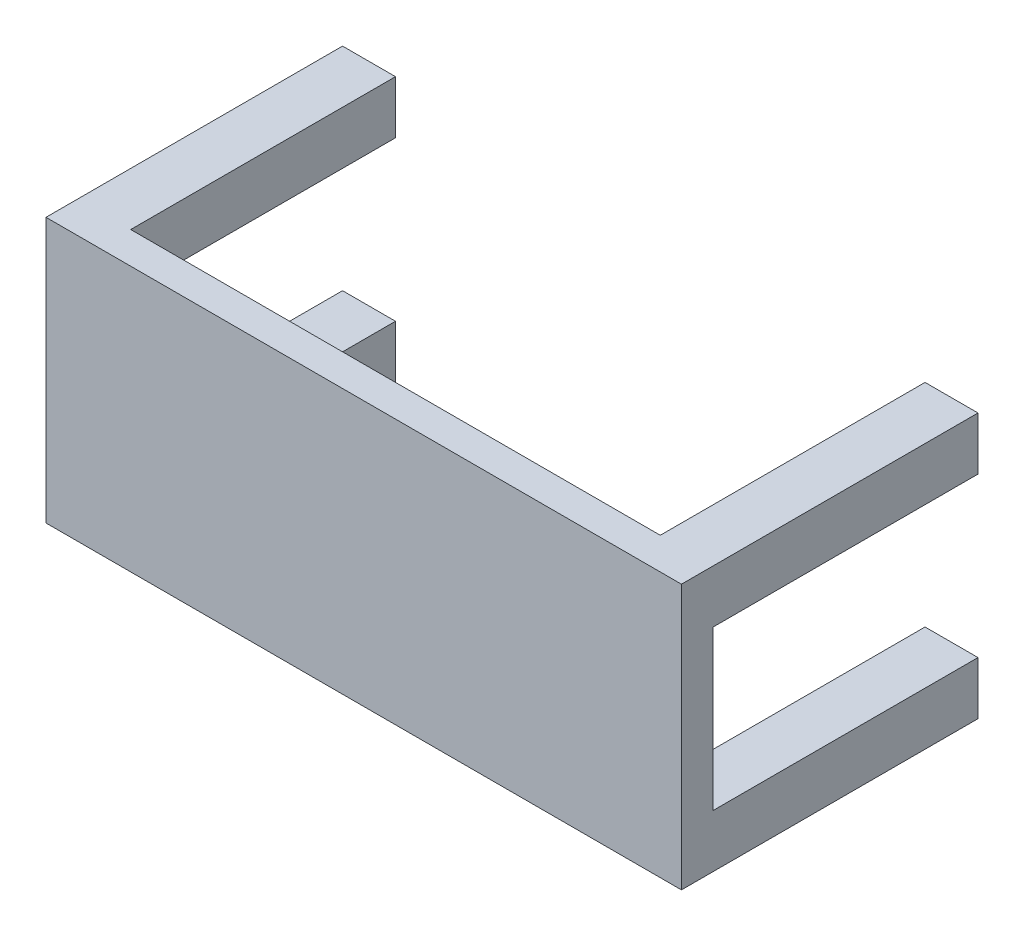
ISO-10303-21;
HEADER;
FILE_DESCRIPTION(('STEP AP214'),'2;1');
FILE_NAME('part.step','',(''),(''),'','','');
FILE_SCHEMA(('AUTOMOTIVE_DESIGN { 1 0 10303 214 1 1 1 1 }'));
ENDSEC;
DATA;
#1=APPLICATION_CONTEXT('core data for automotive mechanical design processes');
#2=APPLICATION_PROTOCOL_DEFINITION('international standard','automotive_design',2000,#1);
#3=PRODUCT_CONTEXT('',#1,'mechanical');
#4=PRODUCT('Part','Part','',(#3));
#5=PRODUCT_RELATED_PRODUCT_CATEGORY('part','',(#4));
#6=PRODUCT_DEFINITION_FORMATION('','',#4);
#7=PRODUCT_DEFINITION_CONTEXT('part definition',#1,'design');
#8=PRODUCT_DEFINITION('design','',#6,#7);
#9=PRODUCT_DEFINITION_SHAPE('','',#8);
#10=(LENGTH_UNIT() NAMED_UNIT(*) SI_UNIT(.MILLI.,.METRE.));
#11=(NAMED_UNIT(*) PLANE_ANGLE_UNIT() SI_UNIT($,.RADIAN.));
#12=(NAMED_UNIT(*) SI_UNIT($,.STERADIAN.) SOLID_ANGLE_UNIT());
#13=UNCERTAINTY_MEASURE_WITH_UNIT(LENGTH_MEASURE(1.E-05),#10,'distance_accuracy_value','');
#14=(GEOMETRIC_REPRESENTATION_CONTEXT(3) GLOBAL_UNCERTAINTY_ASSIGNED_CONTEXT((#13)) GLOBAL_UNIT_ASSIGNED_CONTEXT((#10,
#11,#12)) REPRESENTATION_CONTEXT('',''));
#15=CARTESIAN_POINT('',(0.,0.,0.));
#16=DIRECTION('',(0.,0.,1.));
#17=DIRECTION('',(1.,0.,0.));
#18=AXIS2_PLACEMENT_3D('',#15,#16,#17);
#19=CARTESIAN_POINT('',(-18.1351351351351,25.,-11.1148648648649));
#20=DIRECTION('',(0.,0.,-1.));
#21=DIRECTION('',(-1.,0.,0.));
#22=AXIS2_PLACEMENT_3D('',#19,#20,#21);
#23=PLANE('',#22);
#24=DIRECTION('',(1.,0.,0.));
#25=VECTOR('',#24,1.);
#26=CARTESIAN_POINT('',(-64.1351351351352,5.,-11.1148648648649));
#27=LINE('',#26,#25);
#28=CARTESIAN_POINT('',(-18.1351351351351,5.,-11.1148648648649));
#29=VERTEX_POINT('',#28);
#30=CARTESIAN_POINT('',(-13.1351351351351,5.,-11.1148648648649));
#31=VERTEX_POINT('',#30);
#32=EDGE_CURVE('E271',#29,#31,#27,.T.);
#33=ORIENTED_EDGE('',*,*,#32,.T.);
#34=DIRECTION('',(0.,-1.,0.));
#35=VECTOR('',#34,1.);
#36=CARTESIAN_POINT('',(-13.1351351351351,25.,-11.1148648648649));
#37=LINE('',#36,#35);
#38=CARTESIAN_POINT('',(-13.1351351351351,0.,-11.1148648648649));
#39=VERTEX_POINT('',#38);
#40=EDGE_CURVE('E197',#31,#39,#37,.T.);
#41=ORIENTED_EDGE('',*,*,#40,.T.);
#42=DIRECTION('',(1.,0.,0.));
#43=VECTOR('',#42,1.);
#44=CARTESIAN_POINT('',(-18.1351351351351,0.,-11.1148648648649));
#45=LINE('',#44,#43);
#46=CARTESIAN_POINT('',(-18.1351351351351,0.,-11.1148648648649));
#47=VERTEX_POINT('',#46);
#48=EDGE_CURVE('E242',#47,#39,#45,.T.);
#49=ORIENTED_EDGE('',*,*,#48,.F.);
#50=DIRECTION('',(0.,-1.,0.));
#51=VECTOR('',#50,1.);
#52=CARTESIAN_POINT('',(-18.1351351351351,25.,-11.1148648648649));
#53=LINE('',#52,#51);
#54=EDGE_CURVE('E202',#29,#47,#53,.T.);
#55=ORIENTED_EDGE('',*,*,#54,.F.);
#56=EDGE_LOOP('',(#33,#41,#49,#55));
#57=FACE_BOUND('',#56,.T.);
#58=ADVANCED_FACE('F41',(#57),#23,.T.);
#59=CARTESIAN_POINT('',(36.8648648648649,25.,-11.1148648648649));
#60=DIRECTION('',(0.,0.,-1.));
#61=DIRECTION('',(-1.,0.,0.));
#62=AXIS2_PLACEMENT_3D('',#59,#60,#61);
#63=PLANE('',#62);
#64=CARTESIAN_POINT('',(36.8648648648648,5.,-11.1148648648649));
#65=VERTEX_POINT('',#64);
#66=CARTESIAN_POINT('',(41.8648648648649,5.,-11.1148648648649));
#67=VERTEX_POINT('',#66);
#68=EDGE_CURVE('E278',#65,#67,#27,.T.);
#69=ORIENTED_EDGE('',*,*,#68,.T.);
#70=DIRECTION('',(0.,-1.,0.));
#71=VECTOR('',#70,1.);
#72=CARTESIAN_POINT('',(41.8648648648649,25.,-11.1148648648649));
#73=LINE('',#72,#71);
#74=CARTESIAN_POINT('',(41.8648648648649,0.,-11.1148648648649));
#75=VERTEX_POINT('',#74);
#76=EDGE_CURVE('E177',#67,#75,#73,.T.);
#77=ORIENTED_EDGE('',*,*,#76,.T.);
#78=DIRECTION('',(1.,0.,0.));
#79=VECTOR('',#78,1.);
#80=CARTESIAN_POINT('',(36.8648648648649,0.,-11.1148648648649));
#81=LINE('',#80,#79);
#82=CARTESIAN_POINT('',(36.8648648648649,0.,-11.1148648648649));
#83=VERTEX_POINT('',#82);
#84=EDGE_CURVE('E229',#83,#75,#81,.T.);
#85=ORIENTED_EDGE('',*,*,#84,.F.);
#86=DIRECTION('',(0.,-1.,0.));
#87=VECTOR('',#86,1.);
#88=CARTESIAN_POINT('',(36.8648648648649,25.,-11.1148648648649));
#89=LINE('',#88,#87);
#90=EDGE_CURVE('E186',#65,#83,#89,.T.);
#91=ORIENTED_EDGE('',*,*,#90,.F.);
#92=EDGE_LOOP('',(#69,#77,#85,#91));
#93=FACE_BOUND('',#92,.T.);
#94=ADVANCED_FACE('F291',(#93),#63,.T.);
#95=CARTESIAN_POINT('',(36.8648648648649,25.,13.8851351351351));
#96=DIRECTION('',(-1.,0.,0.));
#97=DIRECTION('',(0.,0.,1.));
#98=AXIS2_PLACEMENT_3D('',#95,#96,#97);
#99=PLANE('',#98);
#100=DIRECTION('',(0.,0.,1.));
#101=VECTOR('',#100,1.);
#102=CARTESIAN_POINT('',(36.8648648648649,5.,13.8851351351351));
#103=LINE('',#102,#101);
#104=CARTESIAN_POINT('',(36.8648648648648,5.,13.8851351351351));
#105=VERTEX_POINT('',#104);
#106=EDGE_CURVE('E264',#65,#105,#103,.T.);
#107=ORIENTED_EDGE('',*,*,#106,.F.);
#108=ORIENTED_EDGE('',*,*,#90,.T.);
#109=DIRECTION('',(0.,0.,-1.));
#110=VECTOR('',#109,1.);
#111=CARTESIAN_POINT('',(36.8648648648649,0.,13.8851351351351));
#112=LINE('',#111,#110);
#113=CARTESIAN_POINT('',(36.8648648648649,0.,13.8851351351351));
#114=VERTEX_POINT('',#113);
#115=EDGE_CURVE('E233',#114,#83,#112,.T.);
#116=ORIENTED_EDGE('',*,*,#115,.F.);
#117=DIRECTION('',(0.,-1.,0.));
#118=VECTOR('',#117,1.);
#119=CARTESIAN_POINT('',(36.8648648648649,25.,13.8851351351351));
#120=LINE('',#119,#118);
#121=EDGE_CURVE('E190',#105,#114,#120,.T.);
#122=ORIENTED_EDGE('',*,*,#121,.F.);
#123=EDGE_LOOP('',(#107,#108,#116,#122));
#124=FACE_BOUND('',#123,.T.);
#125=ADVANCED_FACE('F295',(#124),#99,.T.);
#126=CARTESIAN_POINT('',(-13.1351351351351,25.,-11.1148648648649));
#127=DIRECTION('',(1.,0.,0.));
#128=DIRECTION('',(0.,0.,-1.));
#129=AXIS2_PLACEMENT_3D('',#126,#127,#128);
#130=PLANE('',#129);
#131=DIRECTION('',(0.,0.,-1.));
#132=VECTOR('',#131,1.);
#133=CARTESIAN_POINT('',(-13.1351351351351,5.,-11.1148648648649));
#134=LINE('',#133,#132);
#135=CARTESIAN_POINT('',(-13.1351351351351,5.,13.8851351351351));
#136=VERTEX_POINT('',#135);
#137=EDGE_CURVE('E11',#136,#31,#134,.T.);
#138=ORIENTED_EDGE('',*,*,#137,.F.);
#139=DIRECTION('',(0.,-1.,0.));
#140=VECTOR('',#139,1.);
#141=CARTESIAN_POINT('',(-13.1351351351351,25.,13.8851351351351));
#142=LINE('',#141,#140);
#143=CARTESIAN_POINT('',(-13.1351351351351,0.,13.8851351351351));
#144=VERTEX_POINT('',#143);
#145=EDGE_CURVE('E194',#136,#144,#142,.T.);
#146=ORIENTED_EDGE('',*,*,#145,.T.);
#147=DIRECTION('',(0.,0.,1.));
#148=VECTOR('',#147,1.);
#149=CARTESIAN_POINT('',(-13.1351351351351,0.,-11.1148648648649));
#150=LINE('',#149,#148);
#151=EDGE_CURVE('E239',#39,#144,#150,.T.);
#152=ORIENTED_EDGE('',*,*,#151,.F.);
#153=ORIENTED_EDGE('',*,*,#40,.F.);
#154=EDGE_LOOP('',(#138,#146,#152,#153));
#155=FACE_BOUND('',#154,.T.);
#156=ADVANCED_FACE('F303',(#155),#130,.T.);
#157=DIRECTION('',(1.,0.,0.));
#158=VECTOR('',#157,1.);
#159=CARTESIAN_POINT('',(-64.1351351351352,20.,-11.1148648648649));
#160=LINE('',#159,#158);
#161=CARTESIAN_POINT('',(-18.1351351351351,20.,-11.1148648648649));
#162=VERTEX_POINT('',#161);
#163=CARTESIAN_POINT('',(-13.1351351351351,20.,-11.1148648648649));
#164=VERTEX_POINT('',#163);
#165=EDGE_CURVE('E64',#162,#164,#160,.T.);
#166=ORIENTED_EDGE('',*,*,#165,.F.);
#167=CARTESIAN_POINT('',(-18.1351351351351,25.,-11.1148648648649));
#168=VERTEX_POINT('',#167);
#169=EDGE_CURVE('E198',#168,#162,#53,.T.);
#170=ORIENTED_EDGE('',*,*,#169,.F.);
#171=DIRECTION('',(1.,0.,0.));
#172=VECTOR('',#171,1.);
#173=CARTESIAN_POINT('',(-18.1351351351351,25.,-11.1148648648649));
#174=LINE('',#173,#172);
#175=CARTESIAN_POINT('',(-13.1351351351351,25.,-11.1148648648649));
#176=VERTEX_POINT('',#175);
#177=EDGE_CURVE('E228',#168,#176,#174,.T.);
#178=ORIENTED_EDGE('',*,*,#177,.T.);
#179=EDGE_CURVE('E195',#176,#164,#37,.T.);
#180=ORIENTED_EDGE('',*,*,#179,.T.);
#181=EDGE_LOOP('',(#166,#170,#178,#180));
#182=FACE_BOUND('',#181,.T.);
#183=ADVANCED_FACE('F43',(#182),#23,.T.);
#184=CARTESIAN_POINT('',(-18.1351351351351,25.,-11.1148648648649));
#185=DIRECTION('',(1.,0.,0.));
#186=DIRECTION('',(0.,0.,-1.));
#187=AXIS2_PLACEMENT_3D('',#184,#185,#186);
#188=PLANE('',#187);
#189=DIRECTION('',(0.,-1.,0.));
#190=VECTOR('',#189,1.);
#191=CARTESIAN_POINT('',(-18.1351351351351,25.,13.8851351351351));
#192=LINE('',#191,#190);
#193=CARTESIAN_POINT('',(-18.1351351351351,20.,13.8851351351351));
#194=VERTEX_POINT('',#193);
#195=CARTESIAN_POINT('',(-18.1351351351351,5.,13.8851351351351));
#196=VERTEX_POINT('',#195);
#197=EDGE_CURVE('E266',#194,#196,#192,.T.);
#198=ORIENTED_EDGE('',*,*,#197,.T.);
#199=DIRECTION('',(0.,0.,-1.));
#200=VECTOR('',#199,1.);
#201=CARTESIAN_POINT('',(-18.1351351351351,5.,-11.1148648648649));
#202=LINE('',#201,#200);
#203=EDGE_CURVE('E244',#196,#29,#202,.T.);
#204=ORIENTED_EDGE('',*,*,#203,.T.);
#205=ORIENTED_EDGE('',*,*,#54,.T.);
#206=DIRECTION('',(0.,0.,1.));
#207=VECTOR('',#206,1.);
#208=CARTESIAN_POINT('',(-18.1351351351351,0.,-11.1148648648649));
#209=LINE('',#208,#207);
#210=CARTESIAN_POINT('',(-18.1351351351351,0.,16.8851351351351));
#211=VERTEX_POINT('',#210);
#212=EDGE_CURVE('E208',#47,#211,#209,.T.);
#213=ORIENTED_EDGE('',*,*,#212,.T.);
#214=DIRECTION('',(0.,-1.,0.));
#215=VECTOR('',#214,1.);
#216=CARTESIAN_POINT('',(-18.1351351351351,25.,16.8851351351351));
#217=LINE('',#216,#215);
#218=CARTESIAN_POINT('',(-18.1351351351351,25.,16.8851351351351));
#219=VERTEX_POINT('',#218);
#220=EDGE_CURVE('E180',#219,#211,#217,.T.);
#221=ORIENTED_EDGE('',*,*,#220,.F.);
#222=DIRECTION('',(0.,0.,1.));
#223=VECTOR('',#222,1.);
#224=CARTESIAN_POINT('',(-18.1351351351351,25.,-11.1148648648649));
#225=LINE('',#224,#223);
#226=EDGE_CURVE('E245',#168,#219,#225,.T.);
#227=ORIENTED_EDGE('',*,*,#226,.F.);
#228=ORIENTED_EDGE('',*,*,#169,.T.);
#229=DIRECTION('',(0.,0.,1.));
#230=VECTOR('',#229,1.);
#231=CARTESIAN_POINT('',(-18.1351351351351,20.,-11.1148648648649));
#232=LINE('',#231,#230);
#233=EDGE_CURVE('E269',#162,#194,#232,.T.);
#234=ORIENTED_EDGE('',*,*,#233,.T.);
#235=EDGE_LOOP('',(#198,#204,#205,#213,#221,#227,#228,#234));
#236=FACE_BOUND('',#235,.T.);
#237=ADVANCED_FACE('F309',(#236),#188,.F.);
#238=CARTESIAN_POINT('',(-18.1351351351351,25.,16.8851351351351));
#239=DIRECTION('',(0.,0.,-1.));
#240=DIRECTION('',(-1.,0.,0.));
#241=AXIS2_PLACEMENT_3D('',#238,#239,#240);
#242=PLANE('',#241);
#243=DIRECTION('',(1.,0.,0.));
#244=VECTOR('',#243,1.);
#245=CARTESIAN_POINT('',(-18.1351351351351,0.,16.8851351351351));
#246=LINE('',#245,#244);
#247=CARTESIAN_POINT('',(41.8648648648649,0.,16.8851351351351));
#248=VERTEX_POINT('',#247);
#249=EDGE_CURVE('E216',#211,#248,#246,.T.);
#250=ORIENTED_EDGE('',*,*,#249,.T.);
#251=DIRECTION('',(0.,-1.,0.));
#252=VECTOR('',#251,1.);
#253=CARTESIAN_POINT('',(41.8648648648649,25.,16.8851351351351));
#254=LINE('',#253,#252);
#255=CARTESIAN_POINT('',(41.8648648648649,25.,16.8851351351351));
#256=VERTEX_POINT('',#255);
#257=EDGE_CURVE('E176',#256,#248,#254,.T.);
#258=ORIENTED_EDGE('',*,*,#257,.F.);
#259=DIRECTION('',(1.,0.,0.));
#260=VECTOR('',#259,1.);
#261=CARTESIAN_POINT('',(36.8648648648649,25.,16.8851351351351));
#262=LINE('',#261,#260);
#263=EDGE_CURVE('E217',#219,#256,#262,.T.);
#264=ORIENTED_EDGE('',*,*,#263,.F.);
#265=ORIENTED_EDGE('',*,*,#220,.T.);
#266=EDGE_LOOP('',(#250,#258,#264,#265));
#267=FACE_BOUND('',#266,.T.);
#268=ADVANCED_FACE('F214',(#267),#242,.F.);
#269=CARTESIAN_POINT('',(41.8648648648649,25.,16.8851351351351));
#270=DIRECTION('',(-1.,0.,0.));
#271=DIRECTION('',(0.,0.,1.));
#272=AXIS2_PLACEMENT_3D('',#269,#270,#271);
#273=PLANE('',#272);
#274=ORIENTED_EDGE('',*,*,#76,.F.);
#275=DIRECTION('',(0.,0.,-1.));
#276=VECTOR('',#275,1.);
#277=CARTESIAN_POINT('',(41.8648648648649,5.,-11.1148648648649));
#278=LINE('',#277,#276);
#279=CARTESIAN_POINT('',(41.8648648648649,5.,13.8851351351351));
#280=VERTEX_POINT('',#279);
#281=EDGE_CURVE('E160',#280,#67,#278,.T.);
#282=ORIENTED_EDGE('',*,*,#281,.F.);
#283=DIRECTION('',(0.,-1.,0.));
#284=VECTOR('',#283,1.);
#285=CARTESIAN_POINT('',(41.8648648648649,20.,13.8851351351351));
#286=LINE('',#285,#284);
#287=CARTESIAN_POINT('',(41.8648648648649,20.,13.8851351351351));
#288=VERTEX_POINT('',#287);
#289=EDGE_CURVE('E171',#288,#280,#286,.T.);
#290=ORIENTED_EDGE('',*,*,#289,.F.);
#291=DIRECTION('',(0.,0.,1.));
#292=VECTOR('',#291,1.);
#293=CARTESIAN_POINT('',(41.8648648648649,20.,-11.1148648648649));
#294=LINE('',#293,#292);
#295=CARTESIAN_POINT('',(41.8648648648649,20.,-11.1148648648649));
#296=VERTEX_POINT('',#295);
#297=EDGE_CURVE('E154',#296,#288,#294,.T.);
#298=ORIENTED_EDGE('',*,*,#297,.F.);
#299=CARTESIAN_POINT('',(41.8648648648649,25.,-11.1148648648649));
#300=VERTEX_POINT('',#299);
#301=EDGE_CURVE('E167',#300,#296,#73,.T.);
#302=ORIENTED_EDGE('',*,*,#301,.F.);
#303=DIRECTION('',(0.,0.,-1.));
#304=VECTOR('',#303,1.);
#305=CARTESIAN_POINT('',(41.8648648648649,25.,16.8851351351351));
#306=LINE('',#305,#304);
#307=EDGE_CURVE('E248',#256,#300,#306,.T.);
#308=ORIENTED_EDGE('',*,*,#307,.F.);
#309=ORIENTED_EDGE('',*,*,#257,.T.);
#310=DIRECTION('',(0.,0.,-1.));
#311=VECTOR('',#310,1.);
#312=CARTESIAN_POINT('',(41.8648648648649,0.,16.8851351351351));
#313=LINE('',#312,#311);
#314=EDGE_CURVE('E227',#248,#75,#313,.T.);
#315=ORIENTED_EDGE('',*,*,#314,.T.);
#316=EDGE_LOOP('',(#274,#282,#290,#298,#302,#308,#309,#315));
#317=FACE_BOUND('',#316,.T.);
#318=ADVANCED_FACE('F165',(#317),#273,.F.);
#319=CARTESIAN_POINT('',(36.8648648648648,20.,-11.1148648648649));
#320=VERTEX_POINT('',#319);
#321=EDGE_CURVE('E151',#320,#296,#160,.T.);
#322=ORIENTED_EDGE('',*,*,#321,.F.);
#323=CARTESIAN_POINT('',(36.8648648648649,25.,-11.1148648648649));
#324=VERTEX_POINT('',#323);
#325=EDGE_CURVE('E182',#324,#320,#89,.T.);
#326=ORIENTED_EDGE('',*,*,#325,.F.);
#327=DIRECTION('',(1.,0.,0.));
#328=VECTOR('',#327,1.);
#329=CARTESIAN_POINT('',(36.8648648648649,25.,-11.1148648648649));
#330=LINE('',#329,#328);
#331=EDGE_CURVE('E175',#324,#300,#330,.T.);
#332=ORIENTED_EDGE('',*,*,#331,.T.);
#333=ORIENTED_EDGE('',*,*,#301,.T.);
#334=EDGE_LOOP('',(#322,#326,#332,#333));
#335=FACE_BOUND('',#334,.T.);
#336=ADVANCED_FACE('F173',(#335),#63,.T.);
#337=DIRECTION('',(0.,0.,-1.));
#338=VECTOR('',#337,1.);
#339=CARTESIAN_POINT('',(36.8648648648649,20.,13.8851351351351));
#340=LINE('',#339,#338);
#341=CARTESIAN_POINT('',(36.8648648648649,20.,13.8851351351351));
#342=VERTEX_POINT('',#341);
#343=EDGE_CURVE('E156',#342,#320,#340,.T.);
#344=ORIENTED_EDGE('',*,*,#343,.F.);
#345=CARTESIAN_POINT('',(36.8648648648649,25.,13.8851351351351));
#346=VERTEX_POINT('',#345);
#347=EDGE_CURVE('E187',#346,#342,#120,.T.);
#348=ORIENTED_EDGE('',*,*,#347,.F.);
#349=DIRECTION('',(0.,0.,-1.));
#350=VECTOR('',#349,1.);
#351=CARTESIAN_POINT('',(36.8648648648649,25.,13.8851351351351));
#352=LINE('',#351,#350);
#353=EDGE_CURVE('E251',#346,#324,#352,.T.);
#354=ORIENTED_EDGE('',*,*,#353,.T.);
#355=ORIENTED_EDGE('',*,*,#325,.T.);
#356=EDGE_LOOP('',(#344,#348,#354,#355));
#357=FACE_BOUND('',#356,.T.);
#358=ADVANCED_FACE('F321',(#357),#99,.T.);
#359=CARTESIAN_POINT('',(-13.1351351351351,25.,13.8851351351351));
#360=DIRECTION('',(0.,0.,-1.));
#361=DIRECTION('',(-1.,0.,0.));
#362=AXIS2_PLACEMENT_3D('',#359,#360,#361);
#363=PLANE('',#362);
#364=ORIENTED_EDGE('',*,*,#347,.T.);
#365=DIRECTION('',(1.,0.,0.));
#366=VECTOR('',#365,1.);
#367=CARTESIAN_POINT('',(-64.1351351351352,20.,13.8851351351351));
#368=LINE('',#367,#366);
#369=EDGE_CURVE('E56',#342,#288,#368,.T.);
#370=ORIENTED_EDGE('',*,*,#369,.T.);
#371=ORIENTED_EDGE('',*,*,#289,.T.);
#372=DIRECTION('',(1.,0.,0.));
#373=VECTOR('',#372,1.);
#374=CARTESIAN_POINT('',(-64.1351351351352,5.,13.8851351351351));
#375=LINE('',#374,#373);
#376=EDGE_CURVE('E275',#105,#280,#375,.T.);
#377=ORIENTED_EDGE('',*,*,#376,.F.);
#378=ORIENTED_EDGE('',*,*,#121,.T.);
#379=DIRECTION('',(1.,0.,0.));
#380=VECTOR('',#379,1.);
#381=CARTESIAN_POINT('',(-13.1351351351351,0.,13.8851351351351));
#382=LINE('',#381,#380);
#383=EDGE_CURVE('E236',#144,#114,#382,.T.);
#384=ORIENTED_EDGE('',*,*,#383,.F.);
#385=ORIENTED_EDGE('',*,*,#145,.F.);
#386=EDGE_CURVE('E277',#196,#136,#375,.T.);
#387=ORIENTED_EDGE('',*,*,#386,.F.);
#388=ORIENTED_EDGE('',*,*,#197,.F.);
#389=CARTESIAN_POINT('',(-13.1351351351351,20.,13.8851351351351));
#390=VERTEX_POINT('',#389);
#391=EDGE_CURVE('E274',#194,#390,#368,.T.);
#392=ORIENTED_EDGE('',*,*,#391,.T.);
#393=CARTESIAN_POINT('',(-13.1351351351351,25.,13.8851351351351));
#394=VERTEX_POINT('',#393);
#395=EDGE_CURVE('E191',#394,#390,#142,.T.);
#396=ORIENTED_EDGE('',*,*,#395,.F.);
#397=DIRECTION('',(1.,0.,0.));
#398=VECTOR('',#397,1.);
#399=CARTESIAN_POINT('',(-13.1351351351351,25.,13.8851351351351));
#400=LINE('',#399,#398);
#401=EDGE_CURVE('E254',#394,#346,#400,.T.);
#402=ORIENTED_EDGE('',*,*,#401,.T.);
#403=EDGE_LOOP('',(#364,#370,#371,#377,#378,#384,#385,#387,#388,#392,#396,#402));
#404=FACE_BOUND('',#403,.T.);
#405=ADVANCED_FACE('F284',(#404),#363,.T.);
#406=DIRECTION('',(0.,0.,1.));
#407=VECTOR('',#406,1.);
#408=CARTESIAN_POINT('',(-13.1351351351351,20.,-11.1148648648649));
#409=LINE('',#408,#407);
#410=EDGE_CURVE('E49',#164,#390,#409,.T.);
#411=ORIENTED_EDGE('',*,*,#410,.F.);
#412=ORIENTED_EDGE('',*,*,#179,.F.);
#413=DIRECTION('',(0.,0.,1.));
#414=VECTOR('',#413,1.);
#415=CARTESIAN_POINT('',(-13.1351351351351,25.,-11.1148648648649));
#416=LINE('',#415,#414);
#417=EDGE_CURVE('E257',#176,#394,#416,.T.);
#418=ORIENTED_EDGE('',*,*,#417,.T.);
#419=ORIENTED_EDGE('',*,*,#395,.T.);
#420=EDGE_LOOP('',(#411,#412,#418,#419));
#421=FACE_BOUND('',#420,.T.);
#422=ADVANCED_FACE('F315',(#421),#130,.T.);
#423=CARTESIAN_POINT('',(0.,25.,0.));
#424=DIRECTION('',(0.,-1.,0.));
#425=DIRECTION('',(0.,0.,-1.));
#426=AXIS2_PLACEMENT_3D('',#423,#424,#425);
#427=PLANE('',#426);
#428=ORIENTED_EDGE('',*,*,#177,.F.);
#429=ORIENTED_EDGE('',*,*,#226,.T.);
#430=ORIENTED_EDGE('',*,*,#263,.T.);
#431=ORIENTED_EDGE('',*,*,#307,.T.);
#432=ORIENTED_EDGE('',*,*,#331,.F.);
#433=ORIENTED_EDGE('',*,*,#353,.F.);
#434=ORIENTED_EDGE('',*,*,#401,.F.);
#435=ORIENTED_EDGE('',*,*,#417,.F.);
#436=EDGE_LOOP('',(#428,#429,#430,#431,#432,#433,#434,#435));
#437=FACE_BOUND('',#436,.T.);
#438=ADVANCED_FACE('F318',(#437),#427,.F.);
#439=CARTESIAN_POINT('',(0.,0.,0.));
#440=DIRECTION('',(0.,-1.,0.));
#441=DIRECTION('',(0.,0.,-1.));
#442=AXIS2_PLACEMENT_3D('',#439,#440,#441);
#443=PLANE('',#442);
#444=ORIENTED_EDGE('',*,*,#48,.T.);
#445=ORIENTED_EDGE('',*,*,#151,.T.);
#446=ORIENTED_EDGE('',*,*,#383,.T.);
#447=ORIENTED_EDGE('',*,*,#115,.T.);
#448=ORIENTED_EDGE('',*,*,#84,.T.);
#449=ORIENTED_EDGE('',*,*,#314,.F.);
#450=ORIENTED_EDGE('',*,*,#249,.F.);
#451=ORIENTED_EDGE('',*,*,#212,.F.);
#452=EDGE_LOOP('',(#444,#445,#446,#447,#448,#449,#450,#451));
#453=FACE_BOUND('',#452,.T.);
#454=ADVANCED_FACE('F223',(#453),#443,.T.);
#455=CARTESIAN_POINT('',(-64.1351351351352,20.,-11.1148648648649));
#456=DIRECTION('',(0.,1.,0.));
#457=DIRECTION('',(0.,0.,1.));
#458=AXIS2_PLACEMENT_3D('',#455,#456,#457);
#459=PLANE('',#458);
#460=ORIENTED_EDGE('',*,*,#165,.T.);
#461=ORIENTED_EDGE('',*,*,#410,.T.);
#462=ORIENTED_EDGE('',*,*,#391,.F.);
#463=ORIENTED_EDGE('',*,*,#233,.F.);
#464=EDGE_LOOP('',(#460,#461,#462,#463));
#465=FACE_BOUND('',#464,.T.);
#466=ADVANCED_FACE('F310',(#465),#459,.F.);
#467=CARTESIAN_POINT('',(-64.1351351351352,5.,-11.1148648648649));
#468=DIRECTION('',(0.,-1.,0.));
#469=DIRECTION('',(0.,0.,-1.));
#470=AXIS2_PLACEMENT_3D('',#467,#468,#469);
#471=PLANE('',#470);
#472=ORIENTED_EDGE('',*,*,#386,.T.);
#473=ORIENTED_EDGE('',*,*,#137,.T.);
#474=ORIENTED_EDGE('',*,*,#32,.F.);
#475=ORIENTED_EDGE('',*,*,#203,.F.);
#476=EDGE_LOOP('',(#472,#473,#474,#475));
#477=FACE_BOUND('',#476,.T.);
#478=ADVANCED_FACE('F306',(#477),#471,.F.);
#479=ORIENTED_EDGE('',*,*,#106,.T.);
#480=ORIENTED_EDGE('',*,*,#376,.T.);
#481=ORIENTED_EDGE('',*,*,#281,.T.);
#482=ORIENTED_EDGE('',*,*,#68,.F.);
#483=EDGE_LOOP('',(#479,#480,#481,#482));
#484=FACE_BOUND('',#483,.T.);
#485=ADVANCED_FACE('F287',(#484),#471,.F.);
#486=ORIENTED_EDGE('',*,*,#343,.T.);
#487=ORIENTED_EDGE('',*,*,#321,.T.);
#488=ORIENTED_EDGE('',*,*,#297,.T.);
#489=ORIENTED_EDGE('',*,*,#369,.F.);
#490=EDGE_LOOP('',(#486,#487,#488,#489));
#491=FACE_BOUND('',#490,.T.);
#492=ADVANCED_FACE('F153',(#491),#459,.F.);
#493=CLOSED_SHELL('',(#58,#94,#125,#156,#183,#237,#268,#318,#336,#358,#405,#422,#438,#454,#466,
#478,#485,#492));
#494=MANIFOLD_SOLID_BREP('B2',#493);
#495=ADVANCED_BREP_SHAPE_REPRESENTATION('',(#18,#494),#14);
#496=SHAPE_DEFINITION_REPRESENTATION(#9,#495);
ENDSEC;
END-ISO-10303-21;
